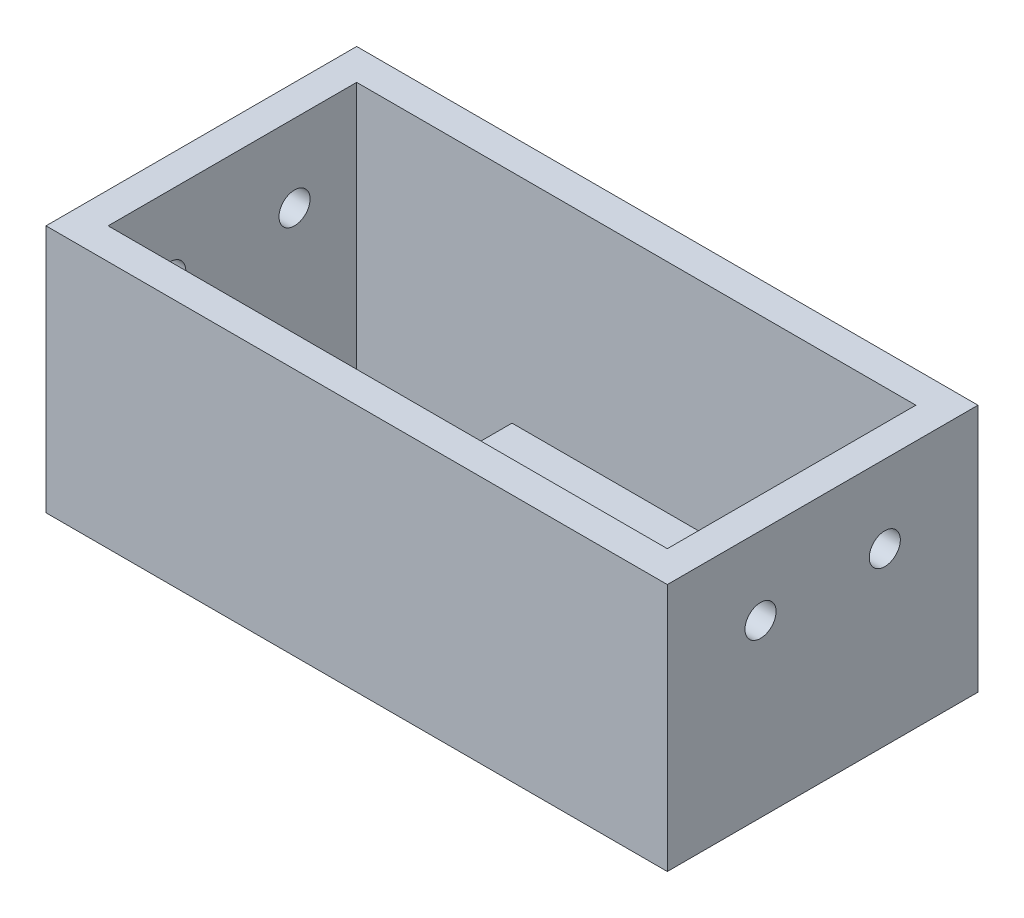
ISO-10303-21;
HEADER;
FILE_DESCRIPTION(('STEP AP214'),'2;1');
FILE_NAME('part.step','',(''),(''),'','','');
FILE_SCHEMA(('AUTOMOTIVE_DESIGN { 1 0 10303 214 1 1 1 1 }'));
ENDSEC;
DATA;
#1=APPLICATION_CONTEXT('core data for automotive mechanical design processes');
#2=APPLICATION_PROTOCOL_DEFINITION('international standard','automotive_design',2000,#1);
#3=PRODUCT_CONTEXT('',#1,'mechanical');
#4=PRODUCT('Part','Part','',(#3));
#5=PRODUCT_RELATED_PRODUCT_CATEGORY('part','',(#4));
#6=PRODUCT_DEFINITION_FORMATION('','',#4);
#7=PRODUCT_DEFINITION_CONTEXT('part definition',#1,'design');
#8=PRODUCT_DEFINITION('design','',#6,#7);
#9=PRODUCT_DEFINITION_SHAPE('','',#8);
#10=(LENGTH_UNIT() NAMED_UNIT(*) SI_UNIT(.MILLI.,.METRE.));
#11=(NAMED_UNIT(*) PLANE_ANGLE_UNIT() SI_UNIT($,.RADIAN.));
#12=(NAMED_UNIT(*) SI_UNIT($,.STERADIAN.) SOLID_ANGLE_UNIT());
#13=UNCERTAINTY_MEASURE_WITH_UNIT(LENGTH_MEASURE(1.E-05),#10,'distance_accuracy_value','');
#14=(GEOMETRIC_REPRESENTATION_CONTEXT(3) GLOBAL_UNCERTAINTY_ASSIGNED_CONTEXT((#13)) GLOBAL_UNIT_ASSIGNED_CONTEXT((#10,
#11,#12)) REPRESENTATION_CONTEXT('',''));
#15=CARTESIAN_POINT('',(0.,0.,0.));
#16=DIRECTION('',(0.,0.,1.));
#17=DIRECTION('',(1.,0.,0.));
#18=AXIS2_PLACEMENT_3D('',#15,#16,#17);
#19=CARTESIAN_POINT('',(0.,40.,0.));
#20=DIRECTION('',(0.,-1.,0.));
#21=DIRECTION('',(0.,0.,-1.));
#22=AXIS2_PLACEMENT_3D('',#19,#20,#21);
#23=PLANE('',#22);
#24=DIRECTION('',(0.,0.,1.));
#25=VECTOR('',#24,1.);
#26=CARTESIAN_POINT('',(-38.2284382284382,40.,0.));
#27=LINE('',#26,#25);
#28=CARTESIAN_POINT('',(-38.2284382284382,40.,-50.));
#29=VERTEX_POINT('',#28);
#30=CARTESIAN_POINT('',(-38.2284382284382,40.,0.));
#31=VERTEX_POINT('',#30);
#32=EDGE_CURVE('E209',#29,#31,#27,.T.);
#33=ORIENTED_EDGE('',*,*,#32,.T.);
#34=DIRECTION('',(1.,0.,0.));
#35=VECTOR('',#34,1.);
#36=CARTESIAN_POINT('',(-38.2284382284382,40.,0.));
#37=LINE('',#36,#35);
#38=CARTESIAN_POINT('',(61.7715617715618,40.,0.));
#39=VERTEX_POINT('',#38);
#40=EDGE_CURVE('E213',#31,#39,#37,.T.);
#41=ORIENTED_EDGE('',*,*,#40,.T.);
#42=DIRECTION('',(0.,0.,-1.));
#43=VECTOR('',#42,1.);
#44=CARTESIAN_POINT('',(61.7715617715618,40.,0.));
#45=LINE('',#44,#43);
#46=CARTESIAN_POINT('',(61.7715617715618,40.,-50.));
#47=VERTEX_POINT('',#46);
#48=EDGE_CURVE('E217',#39,#47,#45,.T.);
#49=ORIENTED_EDGE('',*,*,#48,.T.);
#50=DIRECTION('',(-1.,0.,0.));
#51=VECTOR('',#50,1.);
#52=CARTESIAN_POINT('',(-38.2284382284382,40.,-50.));
#53=LINE('',#52,#51);
#54=EDGE_CURVE('E220',#47,#29,#53,.T.);
#55=ORIENTED_EDGE('',*,*,#54,.T.);
#56=EDGE_LOOP('',(#33,#41,#49,#55));
#57=FACE_BOUND('',#56,.T.);
#58=DIRECTION('',(1.,0.,0.));
#59=VECTOR('',#58,1.);
#60=CARTESIAN_POINT('',(-33.2284382284382,40.,-5.));
#61=LINE('',#60,#59);
#62=CARTESIAN_POINT('',(-33.2284382284382,40.,-5.));
#63=VERTEX_POINT('',#62);
#64=CARTESIAN_POINT('',(56.7715617715618,40.,-5.));
#65=VERTEX_POINT('',#64);
#66=EDGE_CURVE('E166',#63,#65,#61,.T.);
#67=ORIENTED_EDGE('',*,*,#66,.F.);
#68=DIRECTION('',(0.,0.,1.));
#69=VECTOR('',#68,1.);
#70=CARTESIAN_POINT('',(-33.2284382284382,40.,-5.));
#71=LINE('',#70,#69);
#72=CARTESIAN_POINT('',(-33.2284382284382,40.,-45.));
#73=VERTEX_POINT('',#72);
#74=EDGE_CURVE('E177',#73,#63,#71,.T.);
#75=ORIENTED_EDGE('',*,*,#74,.F.);
#76=DIRECTION('',(-1.,0.,0.));
#77=VECTOR('',#76,1.);
#78=CARTESIAN_POINT('',(-33.2284382284382,40.,-45.));
#79=LINE('',#78,#77);
#80=CARTESIAN_POINT('',(56.7715617715618,40.,-45.));
#81=VERTEX_POINT('',#80);
#82=EDGE_CURVE('E173',#81,#73,#79,.T.);
#83=ORIENTED_EDGE('',*,*,#82,.F.);
#84=DIRECTION('',(0.,0.,-1.));
#85=VECTOR('',#84,1.);
#86=CARTESIAN_POINT('',(56.7715617715618,40.,-5.));
#87=LINE('',#86,#85);
#88=EDGE_CURVE('E169',#65,#81,#87,.T.);
#89=ORIENTED_EDGE('',*,*,#88,.F.);
#90=EDGE_LOOP('',(#67,#75,#83,#89));
#91=FACE_BOUND('',#90,.T.);
#92=ADVANCED_FACE('F39',(#57,#91),#23,.F.);
#93=CARTESIAN_POINT('',(0.,0.,0.));
#94=DIRECTION('',(0.,-1.,0.));
#95=DIRECTION('',(0.,0.,-1.));
#96=AXIS2_PLACEMENT_3D('',#93,#94,#95);
#97=PLANE('',#96);
#98=DIRECTION('',(1.,0.,0.));
#99=VECTOR('',#98,1.);
#100=CARTESIAN_POINT('',(-33.2284382284382,0.,-5.));
#101=LINE('',#100,#99);
#102=CARTESIAN_POINT('',(-33.2284382284382,0.,-5.));
#103=VERTEX_POINT('',#102);
#104=CARTESIAN_POINT('',(-8.22843822843824,0.,-5.));
#105=VERTEX_POINT('',#104);
#106=EDGE_CURVE('E181',#103,#105,#101,.T.);
#107=ORIENTED_EDGE('',*,*,#106,.T.);
#108=DIRECTION('',(0.,0.,-1.));
#109=VECTOR('',#108,1.);
#110=CARTESIAN_POINT('',(-8.22843822843824,0.,-45.));
#111=LINE('',#110,#109);
#112=CARTESIAN_POINT('',(-8.22843822843824,0.,-45.));
#113=VERTEX_POINT('',#112);
#114=EDGE_CURVE('E65',#105,#113,#111,.T.);
#115=ORIENTED_EDGE('',*,*,#114,.T.);
#116=DIRECTION('',(-1.,0.,0.));
#117=VECTOR('',#116,1.);
#118=CARTESIAN_POINT('',(-33.2284382284382,0.,-45.));
#119=LINE('',#118,#117);
#120=CARTESIAN_POINT('',(-33.2284382284382,0.,-45.));
#121=VERTEX_POINT('',#120);
#122=EDGE_CURVE('E188',#113,#121,#119,.T.);
#123=ORIENTED_EDGE('',*,*,#122,.T.);
#124=DIRECTION('',(0.,0.,1.));
#125=VECTOR('',#124,1.);
#126=CARTESIAN_POINT('',(-33.2284382284382,0.,-5.));
#127=LINE('',#126,#125);
#128=EDGE_CURVE('E170',#121,#103,#127,.T.);
#129=ORIENTED_EDGE('',*,*,#128,.T.);
#130=EDGE_LOOP('',(#107,#115,#123,#129));
#131=FACE_BOUND('',#130,.T.);
#132=DIRECTION('',(0.,0.,1.));
#133=VECTOR('',#132,1.);
#134=CARTESIAN_POINT('',(-38.2284382284382,0.,0.));
#135=LINE('',#134,#133);
#136=CARTESIAN_POINT('',(-38.2284382284382,0.,-50.));
#137=VERTEX_POINT('',#136);
#138=CARTESIAN_POINT('',(-38.2284382284382,0.,0.));
#139=VERTEX_POINT('',#138);
#140=EDGE_CURVE('E208',#137,#139,#135,.T.);
#141=ORIENTED_EDGE('',*,*,#140,.F.);
#142=DIRECTION('',(-1.,0.,0.));
#143=VECTOR('',#142,1.);
#144=CARTESIAN_POINT('',(-38.2284382284382,0.,-50.));
#145=LINE('',#144,#143);
#146=CARTESIAN_POINT('',(61.7715617715618,0.,-50.));
#147=VERTEX_POINT('',#146);
#148=EDGE_CURVE('E214',#147,#137,#145,.T.);
#149=ORIENTED_EDGE('',*,*,#148,.F.);
#150=DIRECTION('',(0.,0.,-1.));
#151=VECTOR('',#150,1.);
#152=CARTESIAN_POINT('',(61.7715617715618,0.,0.));
#153=LINE('',#152,#151);
#154=CARTESIAN_POINT('',(61.7715617715618,0.,0.));
#155=VERTEX_POINT('',#154);
#156=EDGE_CURVE('E230',#155,#147,#153,.T.);
#157=ORIENTED_EDGE('',*,*,#156,.F.);
#158=DIRECTION('',(1.,0.,0.));
#159=VECTOR('',#158,1.);
#160=CARTESIAN_POINT('',(-38.2284382284382,0.,0.));
#161=LINE('',#160,#159);
#162=EDGE_CURVE('E227',#139,#155,#161,.T.);
#163=ORIENTED_EDGE('',*,*,#162,.F.);
#164=EDGE_LOOP('',(#141,#149,#157,#163));
#165=FACE_BOUND('',#164,.T.);
#166=DIRECTION('',(0.,0.,1.));
#167=VECTOR('',#166,1.);
#168=CARTESIAN_POINT('',(31.7715617715618,0.,-45.));
#169=LINE('',#168,#167);
#170=CARTESIAN_POINT('',(31.7715617715618,0.,-45.));
#171=VERTEX_POINT('',#170);
#172=CARTESIAN_POINT('',(31.7715617715617,0.,-5.));
#173=VERTEX_POINT('',#172);
#174=EDGE_CURVE('E57',#171,#173,#169,.T.);
#175=ORIENTED_EDGE('',*,*,#174,.T.);
#176=CARTESIAN_POINT('',(56.7715617715618,0.,-5.));
#177=VERTEX_POINT('',#176);
#178=EDGE_CURVE('E154',#173,#177,#101,.T.);
#179=ORIENTED_EDGE('',*,*,#178,.T.);
#180=DIRECTION('',(0.,0.,-1.));
#181=VECTOR('',#180,1.);
#182=CARTESIAN_POINT('',(56.7715617715618,0.,-5.));
#183=LINE('',#182,#181);
#184=CARTESIAN_POINT('',(56.7715617715618,0.,-45.));
#185=VERTEX_POINT('',#184);
#186=EDGE_CURVE('E184',#177,#185,#183,.T.);
#187=ORIENTED_EDGE('',*,*,#186,.T.);
#188=EDGE_CURVE('E189',#185,#171,#119,.T.);
#189=ORIENTED_EDGE('',*,*,#188,.T.);
#190=EDGE_LOOP('',(#175,#179,#187,#189));
#191=FACE_BOUND('',#190,.T.);
#192=ADVANCED_FACE('F294',(#131,#165,#191),#97,.T.);
#193=CARTESIAN_POINT('',(-38.2284382284382,40.,0.));
#194=DIRECTION('',(1.,0.,0.));
#195=DIRECTION('',(0.,0.,-1.));
#196=AXIS2_PLACEMENT_3D('',#193,#194,#195);
#197=PLANE('',#196);
#198=CARTESIAN_POINT('',(-38.2284382284382,27.5,-35.));
#199=DIRECTION('',(-1.,0.,0.));
#200=DIRECTION('',(0.,0.,1.));
#201=AXIS2_PLACEMENT_3D('',#198,#199,#200);
#202=CIRCLE('',#201,2.5);
#203=CARTESIAN_POINT('',(-38.2284382284382,27.5,-32.5));
#204=VERTEX_POINT('',#203);
#205=EDGE_CURVE('E248',#204,#204,#202,.T.);
#206=ORIENTED_EDGE('',*,*,#205,.F.);
#207=EDGE_LOOP('',(#206));
#208=FACE_BOUND('',#207,.T.);
#209=CARTESIAN_POINT('',(-38.2284382284382,27.5,-15.));
#210=DIRECTION('',(-1.,0.,0.));
#211=DIRECTION('',(0.,0.,1.));
#212=AXIS2_PLACEMENT_3D('',#209,#210,#211);
#213=CIRCLE('',#212,2.5);
#214=CARTESIAN_POINT('',(-38.2284382284382,27.5,-12.5));
#215=VERTEX_POINT('',#214);
#216=EDGE_CURVE('E257',#215,#215,#213,.T.);
#217=ORIENTED_EDGE('',*,*,#216,.F.);
#218=EDGE_LOOP('',(#217));
#219=FACE_BOUND('',#218,.T.);
#220=ORIENTED_EDGE('',*,*,#140,.T.);
#221=DIRECTION('',(0.,-1.,0.));
#222=VECTOR('',#221,1.);
#223=CARTESIAN_POINT('',(-38.2284382284382,40.,0.));
#224=LINE('',#223,#222);
#225=EDGE_CURVE('E11',#31,#139,#224,.T.);
#226=ORIENTED_EDGE('',*,*,#225,.F.);
#227=ORIENTED_EDGE('',*,*,#32,.F.);
#228=DIRECTION('',(0.,-1.,0.));
#229=VECTOR('',#228,1.);
#230=CARTESIAN_POINT('',(-38.2284382284382,40.,-50.));
#231=LINE('',#230,#229);
#232=EDGE_CURVE('E223',#29,#137,#231,.T.);
#233=ORIENTED_EDGE('',*,*,#232,.T.);
#234=EDGE_LOOP('',(#220,#226,#227,#233));
#235=FACE_BOUND('',#234,.T.);
#236=ADVANCED_FACE('F41',(#208,#219,#235),#197,.F.);
#237=CARTESIAN_POINT('',(-38.2284382284382,40.,0.));
#238=DIRECTION('',(0.,0.,-1.));
#239=DIRECTION('',(-1.,0.,0.));
#240=AXIS2_PLACEMENT_3D('',#237,#238,#239);
#241=PLANE('',#240);
#242=ORIENTED_EDGE('',*,*,#162,.T.);
#243=DIRECTION('',(0.,-1.,0.));
#244=VECTOR('',#243,1.);
#245=CARTESIAN_POINT('',(61.7715617715618,40.,0.));
#246=LINE('',#245,#244);
#247=EDGE_CURVE('E49',#39,#155,#246,.T.);
#248=ORIENTED_EDGE('',*,*,#247,.F.);
#249=ORIENTED_EDGE('',*,*,#40,.F.);
#250=ORIENTED_EDGE('',*,*,#225,.T.);
#251=EDGE_LOOP('',(#242,#248,#249,#250));
#252=FACE_BOUND('',#251,.T.);
#253=ADVANCED_FACE('F327',(#252),#241,.F.);
#254=CARTESIAN_POINT('',(61.7715617715618,40.,0.));
#255=DIRECTION('',(-1.,0.,0.));
#256=DIRECTION('',(0.,0.,1.));
#257=AXIS2_PLACEMENT_3D('',#254,#255,#256);
#258=PLANE('',#257);
#259=CARTESIAN_POINT('',(61.7715617715618,27.5,-35.));
#260=DIRECTION('',(-1.,0.,0.));
#261=DIRECTION('',(0.,0.,1.));
#262=AXIS2_PLACEMENT_3D('',#259,#260,#261);
#263=CIRCLE('',#262,2.5);
#264=CARTESIAN_POINT('',(61.7715617715618,27.5,-32.5));
#265=VERTEX_POINT('',#264);
#266=EDGE_CURVE('E272',#265,#265,#263,.T.);
#267=ORIENTED_EDGE('',*,*,#266,.T.);
#268=EDGE_LOOP('',(#267));
#269=FACE_BOUND('',#268,.T.);
#270=CARTESIAN_POINT('',(61.7715617715618,27.5,-15.));
#271=DIRECTION('',(-1.,0.,0.));
#272=DIRECTION('',(0.,0.,1.));
#273=AXIS2_PLACEMENT_3D('',#270,#271,#272);
#274=CIRCLE('',#273,2.5);
#275=CARTESIAN_POINT('',(61.7715617715618,27.5,-12.5));
#276=VERTEX_POINT('',#275);
#277=EDGE_CURVE('E254',#276,#276,#274,.T.);
#278=ORIENTED_EDGE('',*,*,#277,.T.);
#279=EDGE_LOOP('',(#278));
#280=FACE_BOUND('',#279,.T.);
#281=ORIENTED_EDGE('',*,*,#156,.T.);
#282=DIRECTION('',(0.,-1.,0.));
#283=VECTOR('',#282,1.);
#284=CARTESIAN_POINT('',(61.7715617715618,40.,-50.));
#285=LINE('',#284,#283);
#286=EDGE_CURVE('E238',#47,#147,#285,.T.);
#287=ORIENTED_EDGE('',*,*,#286,.F.);
#288=ORIENTED_EDGE('',*,*,#48,.F.);
#289=ORIENTED_EDGE('',*,*,#247,.T.);
#290=EDGE_LOOP('',(#281,#287,#288,#289));
#291=FACE_BOUND('',#290,.T.);
#292=ADVANCED_FACE('F324',(#269,#280,#291),#258,.F.);
#293=CARTESIAN_POINT('',(-38.2284382284382,40.,-50.));
#294=DIRECTION('',(0.,0.,1.));
#295=DIRECTION('',(1.,0.,0.));
#296=AXIS2_PLACEMENT_3D('',#293,#294,#295);
#297=PLANE('',#296);
#298=ORIENTED_EDGE('',*,*,#148,.T.);
#299=ORIENTED_EDGE('',*,*,#232,.F.);
#300=ORIENTED_EDGE('',*,*,#54,.F.);
#301=ORIENTED_EDGE('',*,*,#286,.T.);
#302=EDGE_LOOP('',(#298,#299,#300,#301));
#303=FACE_BOUND('',#302,.T.);
#304=ADVANCED_FACE('F320',(#303),#297,.F.);
#305=CARTESIAN_POINT('',(-33.2284382284382,40.,-5.));
#306=DIRECTION('',(0.,0.,-1.));
#307=DIRECTION('',(-1.,0.,0.));
#308=AXIS2_PLACEMENT_3D('',#305,#306,#307);
#309=PLANE('',#308);
#310=DIRECTION('',(0.,-1.,0.));
#311=VECTOR('',#310,1.);
#312=CARTESIAN_POINT('',(31.7715617715618,5.,-5.));
#313=LINE('',#312,#311);
#314=CARTESIAN_POINT('',(31.7715617715618,5.,-5.));
#315=VERTEX_POINT('',#314);
#316=EDGE_CURVE('E146',#315,#173,#313,.T.);
#317=ORIENTED_EDGE('',*,*,#316,.F.);
#318=DIRECTION('',(-1.,0.,0.));
#319=VECTOR('',#318,1.);
#320=CARTESIAN_POINT('',(31.7715617715618,5.,-5.));
#321=LINE('',#320,#319);
#322=CARTESIAN_POINT('',(-8.22843822843824,5.,-5.));
#323=VERTEX_POINT('',#322);
#324=EDGE_CURVE('E132',#315,#323,#321,.T.);
#325=ORIENTED_EDGE('',*,*,#324,.T.);
#326=DIRECTION('',(0.,-1.,0.));
#327=VECTOR('',#326,1.);
#328=CARTESIAN_POINT('',(-8.22843822843824,5.,-5.));
#329=LINE('',#328,#327);
#330=EDGE_CURVE('E156',#323,#105,#329,.T.);
#331=ORIENTED_EDGE('',*,*,#330,.T.);
#332=ORIENTED_EDGE('',*,*,#106,.F.);
#333=DIRECTION('',(0.,-1.,0.));
#334=VECTOR('',#333,1.);
#335=CARTESIAN_POINT('',(-33.2284382284382,40.,-5.));
#336=LINE('',#335,#334);
#337=EDGE_CURVE('E180',#63,#103,#336,.T.);
#338=ORIENTED_EDGE('',*,*,#337,.F.);
#339=ORIENTED_EDGE('',*,*,#66,.T.);
#340=DIRECTION('',(0.,-1.,0.));
#341=VECTOR('',#340,1.);
#342=CARTESIAN_POINT('',(56.7715617715618,40.,-5.));
#343=LINE('',#342,#341);
#344=EDGE_CURVE('E205',#65,#177,#343,.T.);
#345=ORIENTED_EDGE('',*,*,#344,.T.);
#346=ORIENTED_EDGE('',*,*,#178,.F.);
#347=EDGE_LOOP('',(#317,#325,#331,#332,#338,#339,#345,#346));
#348=FACE_BOUND('',#347,.T.);
#349=ADVANCED_FACE('F152',(#348),#309,.T.);
#350=CARTESIAN_POINT('',(56.7715617715618,40.,-5.));
#351=DIRECTION('',(-1.,0.,0.));
#352=DIRECTION('',(0.,0.,1.));
#353=AXIS2_PLACEMENT_3D('',#350,#351,#352);
#354=PLANE('',#353);
#355=CARTESIAN_POINT('',(56.7715617715618,27.5,-35.));
#356=DIRECTION('',(-1.,0.,0.));
#357=DIRECTION('',(0.,0.,1.));
#358=AXIS2_PLACEMENT_3D('',#355,#356,#357);
#359=CIRCLE('',#358,2.5);
#360=CARTESIAN_POINT('',(56.7715617715618,27.5,-32.5));
#361=VERTEX_POINT('',#360);
#362=EDGE_CURVE('E268',#361,#361,#359,.T.);
#363=ORIENTED_EDGE('',*,*,#362,.F.);
#364=EDGE_LOOP('',(#363));
#365=FACE_BOUND('',#364,.T.);
#366=CARTESIAN_POINT('',(56.7715617715618,27.5,-15.));
#367=DIRECTION('',(-1.,0.,0.));
#368=DIRECTION('',(0.,0.,1.));
#369=AXIS2_PLACEMENT_3D('',#366,#367,#368);
#370=CIRCLE('',#369,2.5);
#371=CARTESIAN_POINT('',(56.7715617715618,27.5,-12.5));
#372=VERTEX_POINT('',#371);
#373=EDGE_CURVE('E247',#372,#372,#370,.T.);
#374=ORIENTED_EDGE('',*,*,#373,.F.);
#375=EDGE_LOOP('',(#374));
#376=FACE_BOUND('',#375,.T.);
#377=ORIENTED_EDGE('',*,*,#186,.F.);
#378=ORIENTED_EDGE('',*,*,#344,.F.);
#379=ORIENTED_EDGE('',*,*,#88,.T.);
#380=DIRECTION('',(0.,-1.,0.));
#381=VECTOR('',#380,1.);
#382=CARTESIAN_POINT('',(56.7715617715618,40.,-45.));
#383=LINE('',#382,#381);
#384=EDGE_CURVE('E202',#81,#185,#383,.T.);
#385=ORIENTED_EDGE('',*,*,#384,.T.);
#386=EDGE_LOOP('',(#377,#378,#379,#385));
#387=FACE_BOUND('',#386,.T.);
#388=ADVANCED_FACE('F297',(#365,#376,#387),#354,.T.);
#389=CARTESIAN_POINT('',(-33.2284382284382,40.,-45.));
#390=DIRECTION('',(0.,0.,1.));
#391=DIRECTION('',(1.,0.,0.));
#392=AXIS2_PLACEMENT_3D('',#389,#390,#391);
#393=PLANE('',#392);
#394=DIRECTION('',(0.,-1.,0.));
#395=VECTOR('',#394,1.);
#396=CARTESIAN_POINT('',(31.7715617715618,5.,-45.));
#397=LINE('',#396,#395);
#398=CARTESIAN_POINT('',(31.7715617715618,5.,-45.));
#399=VERTEX_POINT('',#398);
#400=EDGE_CURVE('E149',#399,#171,#397,.T.);
#401=ORIENTED_EDGE('',*,*,#400,.T.);
#402=ORIENTED_EDGE('',*,*,#188,.F.);
#403=ORIENTED_EDGE('',*,*,#384,.F.);
#404=ORIENTED_EDGE('',*,*,#82,.T.);
#405=DIRECTION('',(0.,-1.,0.));
#406=VECTOR('',#405,1.);
#407=CARTESIAN_POINT('',(-33.2284382284382,40.,-45.));
#408=LINE('',#407,#406);
#409=EDGE_CURVE('E198',#73,#121,#408,.T.);
#410=ORIENTED_EDGE('',*,*,#409,.T.);
#411=ORIENTED_EDGE('',*,*,#122,.F.);
#412=DIRECTION('',(0.,-1.,0.));
#413=VECTOR('',#412,1.);
#414=CARTESIAN_POINT('',(-8.22843822843824,5.,-45.));
#415=LINE('',#414,#413);
#416=CARTESIAN_POINT('',(-8.22843822843824,5.,-45.));
#417=VERTEX_POINT('',#416);
#418=EDGE_CURVE('E161',#417,#113,#415,.T.);
#419=ORIENTED_EDGE('',*,*,#418,.F.);
#420=DIRECTION('',(1.,0.,0.));
#421=VECTOR('',#420,1.);
#422=CARTESIAN_POINT('',(31.7715617715618,5.,-45.));
#423=LINE('',#422,#421);
#424=EDGE_CURVE('E157',#417,#399,#423,.T.);
#425=ORIENTED_EDGE('',*,*,#424,.T.);
#426=EDGE_LOOP('',(#401,#402,#403,#404,#410,#411,#419,#425));
#427=FACE_BOUND('',#426,.T.);
#428=ADVANCED_FACE('F289',(#427),#393,.T.);
#429=CARTESIAN_POINT('',(-33.2284382284382,40.,-5.));
#430=DIRECTION('',(1.,0.,0.));
#431=DIRECTION('',(0.,0.,-1.));
#432=AXIS2_PLACEMENT_3D('',#429,#430,#431);
#433=PLANE('',#432);
#434=CARTESIAN_POINT('',(-33.2284382284382,27.5,-35.));
#435=DIRECTION('',(1.,0.,0.));
#436=DIRECTION('',(0.,0.,-1.));
#437=AXIS2_PLACEMENT_3D('',#434,#435,#436);
#438=CIRCLE('',#437,2.5);
#439=CARTESIAN_POINT('',(-33.2284382284382,27.5,-37.5));
#440=VERTEX_POINT('',#439);
#441=EDGE_CURVE('E43',#440,#440,#438,.T.);
#442=ORIENTED_EDGE('',*,*,#441,.F.);
#443=EDGE_LOOP('',(#442));
#444=FACE_BOUND('',#443,.T.);
#445=CARTESIAN_POINT('',(-33.2284382284382,27.5,-15.));
#446=DIRECTION('',(1.,0.,0.));
#447=DIRECTION('',(0.,0.,-1.));
#448=AXIS2_PLACEMENT_3D('',#445,#446,#447);
#449=CIRCLE('',#448,2.5);
#450=CARTESIAN_POINT('',(-33.2284382284382,27.5,-17.5));
#451=VERTEX_POINT('',#450);
#452=EDGE_CURVE('E244',#451,#451,#449,.T.);
#453=ORIENTED_EDGE('',*,*,#452,.F.);
#454=EDGE_LOOP('',(#453));
#455=FACE_BOUND('',#454,.T.);
#456=ORIENTED_EDGE('',*,*,#128,.F.);
#457=ORIENTED_EDGE('',*,*,#409,.F.);
#458=ORIENTED_EDGE('',*,*,#74,.T.);
#459=ORIENTED_EDGE('',*,*,#337,.T.);
#460=EDGE_LOOP('',(#456,#457,#458,#459));
#461=FACE_BOUND('',#460,.T.);
#462=ADVANCED_FACE('F307',(#444,#455,#461),#433,.T.);
#463=CARTESIAN_POINT('',(31.7715617715618,5.,-45.));
#464=DIRECTION('',(1.,0.,0.));
#465=DIRECTION('',(0.,0.,-1.));
#466=AXIS2_PLACEMENT_3D('',#463,#464,#465);
#467=PLANE('',#466);
#468=ORIENTED_EDGE('',*,*,#174,.F.);
#469=ORIENTED_EDGE('',*,*,#400,.F.);
#470=DIRECTION('',(0.,0.,1.));
#471=VECTOR('',#470,1.);
#472=CARTESIAN_POINT('',(31.7715617715618,5.,-45.));
#473=LINE('',#472,#471);
#474=EDGE_CURVE('E136',#399,#315,#473,.T.);
#475=ORIENTED_EDGE('',*,*,#474,.T.);
#476=ORIENTED_EDGE('',*,*,#316,.T.);
#477=EDGE_LOOP('',(#468,#469,#475,#476));
#478=FACE_BOUND('',#477,.T.);
#479=ADVANCED_FACE('F145',(#478),#467,.T.);
#480=CARTESIAN_POINT('',(-8.22843822843824,5.,-45.));
#481=DIRECTION('',(-1.,0.,0.));
#482=DIRECTION('',(0.,0.,1.));
#483=AXIS2_PLACEMENT_3D('',#480,#481,#482);
#484=PLANE('',#483);
#485=ORIENTED_EDGE('',*,*,#114,.F.);
#486=ORIENTED_EDGE('',*,*,#330,.F.);
#487=DIRECTION('',(0.,0.,-1.));
#488=VECTOR('',#487,1.);
#489=CARTESIAN_POINT('',(-8.22843822843824,5.,-45.));
#490=LINE('',#489,#488);
#491=EDGE_CURVE('E138',#323,#417,#490,.T.);
#492=ORIENTED_EDGE('',*,*,#491,.T.);
#493=ORIENTED_EDGE('',*,*,#418,.T.);
#494=EDGE_LOOP('',(#485,#486,#492,#493));
#495=FACE_BOUND('',#494,.T.);
#496=ADVANCED_FACE('F287',(#495),#484,.T.);
#497=CARTESIAN_POINT('',(0.,5.,0.));
#498=DIRECTION('',(0.,-1.,0.));
#499=DIRECTION('',(0.,0.,-1.));
#500=AXIS2_PLACEMENT_3D('',#497,#498,#499);
#501=PLANE('',#500);
#502=ORIENTED_EDGE('',*,*,#474,.F.);
#503=ORIENTED_EDGE('',*,*,#424,.F.);
#504=ORIENTED_EDGE('',*,*,#491,.F.);
#505=ORIENTED_EDGE('',*,*,#324,.F.);
#506=EDGE_LOOP('',(#502,#503,#504,#505));
#507=FACE_BOUND('',#506,.T.);
#508=ADVANCED_FACE('F134',(#507),#501,.F.);
#509=CARTESIAN_POINT('',(77.7715617715618,27.5,-15.));
#510=DIRECTION('',(-1.,0.,0.));
#511=DIRECTION('',(0.,0.,1.));
#512=AXIS2_PLACEMENT_3D('',#509,#510,#511);
#513=CYLINDRICAL_SURFACE('',#512,2.5);
#514=ORIENTED_EDGE('',*,*,#452,.T.);
#515=EDGE_LOOP('',(#514));
#516=FACE_BOUND('',#515,.T.);
#517=ORIENTED_EDGE('',*,*,#216,.T.);
#518=EDGE_LOOP('',(#517));
#519=FACE_BOUND('',#518,.T.);
#520=ADVANCED_FACE('F350',(#516,#519),#513,.F.);
#521=CARTESIAN_POINT('',(77.7715617715618,27.5,-35.));
#522=DIRECTION('',(-1.,0.,0.));
#523=DIRECTION('',(0.,0.,1.));
#524=AXIS2_PLACEMENT_3D('',#521,#522,#523);
#525=CYLINDRICAL_SURFACE('',#524,2.5);
#526=ORIENTED_EDGE('',*,*,#441,.T.);
#527=EDGE_LOOP('',(#526));
#528=FACE_BOUND('',#527,.T.);
#529=ORIENTED_EDGE('',*,*,#205,.T.);
#530=EDGE_LOOP('',(#529));
#531=FACE_BOUND('',#530,.T.);
#532=ADVANCED_FACE('F352',(#528,#531),#525,.F.);
#533=ORIENTED_EDGE('',*,*,#373,.T.);
#534=EDGE_LOOP('',(#533));
#535=FACE_BOUND('',#534,.T.);
#536=ORIENTED_EDGE('',*,*,#277,.F.);
#537=EDGE_LOOP('',(#536));
#538=FACE_BOUND('',#537,.T.);
#539=ADVANCED_FACE('F354',(#535,#538),#513,.F.);
#540=ORIENTED_EDGE('',*,*,#362,.T.);
#541=EDGE_LOOP('',(#540));
#542=FACE_BOUND('',#541,.T.);
#543=ORIENTED_EDGE('',*,*,#266,.F.);
#544=EDGE_LOOP('',(#543));
#545=FACE_BOUND('',#544,.T.);
#546=ADVANCED_FACE('F361',(#542,#545),#525,.F.);
#547=CLOSED_SHELL('',(#92,#192,#236,#253,#292,#304,#349,#388,#428,#462,#479,#496,#508,#520,#532,
#539,#546));
#548=MANIFOLD_SOLID_BREP('B2',#547);
#549=ADVANCED_BREP_SHAPE_REPRESENTATION('',(#18,#548),#14);
#550=SHAPE_DEFINITION_REPRESENTATION(#9,#549);
ENDSEC;
END-ISO-10303-21;
